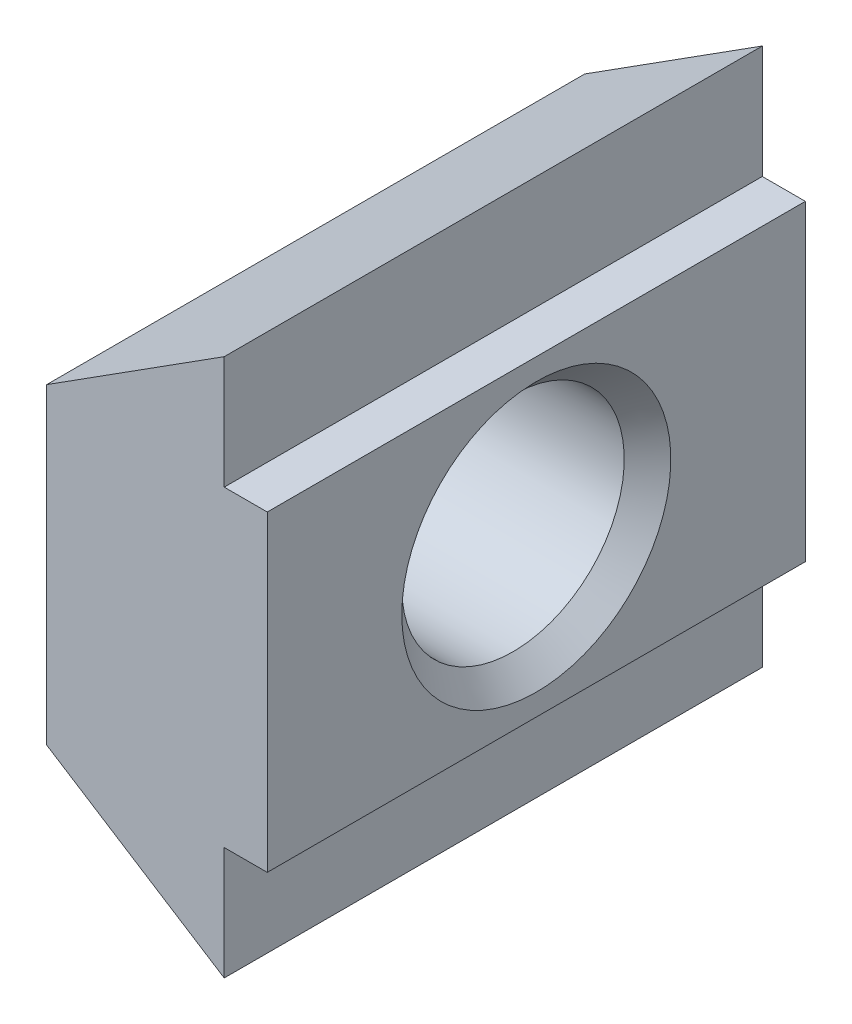
ISO-10303-21;
HEADER;
FILE_DESCRIPTION(('STEP AP214'),'2;1');
FILE_NAME('part.step','',(''),(''),'','','');
FILE_SCHEMA(('AUTOMOTIVE_DESIGN { 1 0 10303 214 1 1 1 1 }'));
ENDSEC;
DATA;
#1=APPLICATION_CONTEXT('core data for automotive mechanical design processes');
#2=APPLICATION_PROTOCOL_DEFINITION('international standard','automotive_design',2000,#1);
#3=PRODUCT_CONTEXT('',#1,'mechanical');
#4=PRODUCT('Part','Part','',(#3));
#5=PRODUCT_RELATED_PRODUCT_CATEGORY('part','',(#4));
#6=PRODUCT_DEFINITION_FORMATION('','',#4);
#7=PRODUCT_DEFINITION_CONTEXT('part definition',#1,'design');
#8=PRODUCT_DEFINITION('design','',#6,#7);
#9=PRODUCT_DEFINITION_SHAPE('','',#8);
#10=(LENGTH_UNIT() NAMED_UNIT(*) SI_UNIT(.MILLI.,.METRE.));
#11=(NAMED_UNIT(*) PLANE_ANGLE_UNIT() SI_UNIT($,.RADIAN.));
#12=(NAMED_UNIT(*) SI_UNIT($,.STERADIAN.) SOLID_ANGLE_UNIT());
#13=UNCERTAINTY_MEASURE_WITH_UNIT(LENGTH_MEASURE(1.E-05),#10,'distance_accuracy_value','');
#14=(GEOMETRIC_REPRESENTATION_CONTEXT(3) GLOBAL_UNCERTAINTY_ASSIGNED_CONTEXT((#13)) GLOBAL_UNIT_ASSIGNED_CONTEXT((#10,
#11,#12)) REPRESENTATION_CONTEXT('',''));
#15=CARTESIAN_POINT('',(0.,0.,0.));
#16=DIRECTION('',(0.,0.,1.));
#17=DIRECTION('',(1.,0.,0.));
#18=AXIS2_PLACEMENT_3D('',#15,#16,#17);
#19=CARTESIAN_POINT('',(-4.1,2.9,5.));
#20=DIRECTION('',(1.,0.,0.));
#21=DIRECTION('',(0.,0.,-1.));
#22=AXIS2_PLACEMENT_3D('',#19,#20,#21);
#23=PLANE('',#22);
#24=DIRECTION('',(0.,0.,-1.));
#25=VECTOR('',#24,1.);
#26=CARTESIAN_POINT('',(-4.1,2.9,5.));
#27=LINE('',#26,#25);
#28=CARTESIAN_POINT('',(-4.1,2.9,5.));
#29=VERTEX_POINT('',#28);
#30=CARTESIAN_POINT('',(-4.1,2.9,-5.));
#31=VERTEX_POINT('',#30);
#32=EDGE_CURVE('E11',#29,#31,#27,.T.);
#33=ORIENTED_EDGE('',*,*,#32,.T.);
#34=DIRECTION('',(0.,-1.,0.));
#35=VECTOR('',#34,1.);
#36=CARTESIAN_POINT('',(-4.1,2.9,-5.));
#37=LINE('',#36,#35);
#38=CARTESIAN_POINT('',(-4.1,-2.9,-5.));
#39=VERTEX_POINT('',#38);
#40=EDGE_CURVE('E102',#31,#39,#37,.T.);
#41=ORIENTED_EDGE('',*,*,#40,.T.);
#42=DIRECTION('',(0.,0.,-1.));
#43=VECTOR('',#42,1.);
#44=CARTESIAN_POINT('',(-4.1,-2.9,5.));
#45=LINE('',#44,#43);
#46=CARTESIAN_POINT('',(-4.1,-2.9,5.));
#47=VERTEX_POINT('',#46);
#48=EDGE_CURVE('E43',#47,#39,#45,.T.);
#49=ORIENTED_EDGE('',*,*,#48,.F.);
#50=DIRECTION('',(0.,-1.,0.));
#51=VECTOR('',#50,1.);
#52=CARTESIAN_POINT('',(-4.1,2.9,5.));
#53=LINE('',#52,#51);
#54=EDGE_CURVE('E103',#29,#47,#53,.T.);
#55=ORIENTED_EDGE('',*,*,#54,.F.);
#56=EDGE_LOOP('',(#33,#41,#49,#55));
#57=FACE_BOUND('',#56,.T.);
#58=CARTESIAN_POINT('',(-4.1,0.,0.));
#59=DIRECTION('',(-1.,0.,0.));
#60=DIRECTION('',(0.,0.,1.));
#61=AXIS2_PLACEMENT_3D('',#58,#59,#60);
#62=CIRCLE('',#61,2.5);
#63=CARTESIAN_POINT('',(-4.1,0.,2.5));
#64=VERTEX_POINT('',#63);
#65=EDGE_CURVE('E119',#64,#64,#62,.T.);
#66=ORIENTED_EDGE('',*,*,#65,.F.);
#67=EDGE_LOOP('',(#66));
#68=FACE_BOUND('',#67,.T.);
#69=ADVANCED_FACE('F35',(#57,#68),#23,.F.);
#70=CARTESIAN_POINT('',(0.,-2.9,5.));
#71=DIRECTION('',(-1.,0.,0.));
#72=DIRECTION('',(0.,0.,1.));
#73=AXIS2_PLACEMENT_3D('',#70,#71,#72);
#74=PLANE('',#73);
#75=DIRECTION('',(0.,0.,-1.));
#76=VECTOR('',#75,1.);
#77=CARTESIAN_POINT('',(0.,-2.9,5.));
#78=LINE('',#77,#76);
#79=CARTESIAN_POINT('',(0.,-2.9,5.));
#80=VERTEX_POINT('',#79);
#81=CARTESIAN_POINT('',(0.,-2.9,-5.));
#82=VERTEX_POINT('',#81);
#83=EDGE_CURVE('E159',#80,#82,#78,.T.);
#84=ORIENTED_EDGE('',*,*,#83,.T.);
#85=DIRECTION('',(0.,1.,0.));
#86=VECTOR('',#85,1.);
#87=CARTESIAN_POINT('',(0.,-2.9,-5.));
#88=LINE('',#87,#86);
#89=CARTESIAN_POINT('',(0.,2.9,-5.));
#90=VERTEX_POINT('',#89);
#91=EDGE_CURVE('E133',#82,#90,#88,.T.);
#92=ORIENTED_EDGE('',*,*,#91,.T.);
#93=DIRECTION('',(0.,0.,-1.));
#94=VECTOR('',#93,1.);
#95=CARTESIAN_POINT('',(0.,2.9,5.));
#96=LINE('',#95,#94);
#97=CARTESIAN_POINT('',(0.,2.9,5.));
#98=VERTEX_POINT('',#97);
#99=EDGE_CURVE('E157',#98,#90,#96,.T.);
#100=ORIENTED_EDGE('',*,*,#99,.F.);
#101=DIRECTION('',(0.,1.,0.));
#102=VECTOR('',#101,1.);
#103=CARTESIAN_POINT('',(0.,-2.9,5.));
#104=LINE('',#103,#102);
#105=EDGE_CURVE('E150',#80,#98,#104,.T.);
#106=ORIENTED_EDGE('',*,*,#105,.F.);
#107=EDGE_LOOP('',(#84,#92,#100,#106));
#108=FACE_BOUND('',#107,.T.);
#109=CARTESIAN_POINT('',(0.,0.,0.));
#110=DIRECTION('',(-1.,0.,0.));
#111=DIRECTION('',(0.,0.,1.));
#112=AXIS2_PLACEMENT_3D('',#109,#110,#111);
#113=CIRCLE('',#112,2.5);
#114=CARTESIAN_POINT('',(0.,0.,2.5));
#115=VERTEX_POINT('',#114);
#116=EDGE_CURVE('E291',#115,#115,#113,.T.);
#117=ORIENTED_EDGE('',*,*,#116,.T.);
#118=EDGE_LOOP('',(#117));
#119=FACE_BOUND('',#118,.T.);
#120=ADVANCED_FACE('F182',(#108,#119),#74,.F.);
#121=CARTESIAN_POINT('',(-0.8,5.,5.));
#122=DIRECTION('',(0.536875492193159,-0.843661487732108,0.));
#123=DIRECTION('',(0.843661487732108,0.536875492193159,0.));
#124=AXIS2_PLACEMENT_3D('',#121,#122,#123);
#125=PLANE('',#124);
#126=DIRECTION('',(0.,0.,-1.));
#127=VECTOR('',#126,1.);
#128=CARTESIAN_POINT('',(-0.8,5.,5.));
#129=LINE('',#128,#127);
#130=CARTESIAN_POINT('',(-0.8,5.,5.));
#131=VERTEX_POINT('',#130);
#132=CARTESIAN_POINT('',(-0.8,5.,-5.));
#133=VERTEX_POINT('',#132);
#134=EDGE_CURVE('E118',#131,#133,#129,.T.);
#135=ORIENTED_EDGE('',*,*,#134,.T.);
#136=DIRECTION('',(-0.843661487732108,-0.536875492193159,0.));
#137=VECTOR('',#136,1.);
#138=CARTESIAN_POINT('',(-0.8,5.,-5.));
#139=LINE('',#138,#137);
#140=EDGE_CURVE('E112',#133,#31,#139,.T.);
#141=ORIENTED_EDGE('',*,*,#140,.T.);
#142=ORIENTED_EDGE('',*,*,#32,.F.);
#143=DIRECTION('',(-0.843661487732108,-0.536875492193159,0.));
#144=VECTOR('',#143,1.);
#145=CARTESIAN_POINT('',(-0.8,5.,5.));
#146=LINE('',#145,#144);
#147=EDGE_CURVE('E141',#131,#29,#146,.T.);
#148=ORIENTED_EDGE('',*,*,#147,.F.);
#149=EDGE_LOOP('',(#135,#141,#142,#148));
#150=FACE_BOUND('',#149,.T.);
#151=ADVANCED_FACE('F37',(#150),#125,.F.);
#152=CARTESIAN_POINT('',(-4.1,-2.9,5.));
#153=DIRECTION('',(0.536875492193159,0.843661487732108,0.));
#154=DIRECTION('',(-0.843661487732108,0.536875492193159,0.));
#155=AXIS2_PLACEMENT_3D('',#152,#153,#154);
#156=PLANE('',#155);
#157=ORIENTED_EDGE('',*,*,#48,.T.);
#158=DIRECTION('',(0.843661487732108,-0.536875492193159,0.));
#159=VECTOR('',#158,1.);
#160=CARTESIAN_POINT('',(-4.1,-2.9,-5.));
#161=LINE('',#160,#159);
#162=CARTESIAN_POINT('',(-0.8,-5.,-5.));
#163=VERTEX_POINT('',#162);
#164=EDGE_CURVE('E116',#39,#163,#161,.T.);
#165=ORIENTED_EDGE('',*,*,#164,.T.);
#166=DIRECTION('',(0.,0.,-1.));
#167=VECTOR('',#166,1.);
#168=CARTESIAN_POINT('',(-0.8,-5.,5.));
#169=LINE('',#168,#167);
#170=CARTESIAN_POINT('',(-0.8,-5.,5.));
#171=VERTEX_POINT('',#170);
#172=EDGE_CURVE('E163',#171,#163,#169,.T.);
#173=ORIENTED_EDGE('',*,*,#172,.F.);
#174=DIRECTION('',(0.843661487732108,-0.536875492193159,0.));
#175=VECTOR('',#174,1.);
#176=CARTESIAN_POINT('',(-4.1,-2.9,5.));
#177=LINE('',#176,#175);
#178=EDGE_CURVE('E144',#47,#171,#177,.T.);
#179=ORIENTED_EDGE('',*,*,#178,.F.);
#180=EDGE_LOOP('',(#157,#165,#173,#179));
#181=FACE_BOUND('',#180,.T.);
#182=ADVANCED_FACE('F166',(#181),#156,.F.);
#183=CARTESIAN_POINT('',(-0.8,-5.,5.));
#184=DIRECTION('',(-1.,0.,0.));
#185=DIRECTION('',(0.,0.,1.));
#186=AXIS2_PLACEMENT_3D('',#183,#184,#185);
#187=PLANE('',#186);
#188=ORIENTED_EDGE('',*,*,#172,.T.);
#189=DIRECTION('',(0.,1.,0.));
#190=VECTOR('',#189,1.);
#191=CARTESIAN_POINT('',(-0.8,-5.,-5.));
#192=LINE('',#191,#190);
#193=CARTESIAN_POINT('',(-0.8,-2.9,-5.));
#194=VERTEX_POINT('',#193);
#195=EDGE_CURVE('E127',#163,#194,#192,.T.);
#196=ORIENTED_EDGE('',*,*,#195,.T.);
#197=DIRECTION('',(0.,0.,-1.));
#198=VECTOR('',#197,1.);
#199=CARTESIAN_POINT('',(-0.8,-2.9,5.));
#200=LINE('',#199,#198);
#201=CARTESIAN_POINT('',(-0.8,-2.9,5.));
#202=VERTEX_POINT('',#201);
#203=EDGE_CURVE('E161',#202,#194,#200,.T.);
#204=ORIENTED_EDGE('',*,*,#203,.F.);
#205=DIRECTION('',(0.,1.,0.));
#206=VECTOR('',#205,1.);
#207=CARTESIAN_POINT('',(-0.8,-5.,5.));
#208=LINE('',#207,#206);
#209=EDGE_CURVE('E146',#171,#202,#208,.T.);
#210=ORIENTED_EDGE('',*,*,#209,.F.);
#211=EDGE_LOOP('',(#188,#196,#204,#210));
#212=FACE_BOUND('',#211,.T.);
#213=ADVANCED_FACE('F174',(#212),#187,.F.);
#214=CARTESIAN_POINT('',(-0.8,-2.9,5.));
#215=DIRECTION('',(0.,1.,0.));
#216=DIRECTION('',(0.,0.,1.));
#217=AXIS2_PLACEMENT_3D('',#214,#215,#216);
#218=PLANE('',#217);
#219=ORIENTED_EDGE('',*,*,#203,.T.);
#220=DIRECTION('',(1.,0.,0.));
#221=VECTOR('',#220,1.);
#222=CARTESIAN_POINT('',(-0.8,-2.9,-5.));
#223=LINE('',#222,#221);
#224=EDGE_CURVE('E130',#194,#82,#223,.T.);
#225=ORIENTED_EDGE('',*,*,#224,.T.);
#226=ORIENTED_EDGE('',*,*,#83,.F.);
#227=DIRECTION('',(1.,0.,0.));
#228=VECTOR('',#227,1.);
#229=CARTESIAN_POINT('',(-0.8,-2.9,5.));
#230=LINE('',#229,#228);
#231=EDGE_CURVE('E148',#202,#80,#230,.T.);
#232=ORIENTED_EDGE('',*,*,#231,.F.);
#233=EDGE_LOOP('',(#219,#225,#226,#232));
#234=FACE_BOUND('',#233,.T.);
#235=ADVANCED_FACE('F177',(#234),#218,.F.);
#236=CARTESIAN_POINT('',(0.,2.9,5.));
#237=DIRECTION('',(0.,-1.,0.));
#238=DIRECTION('',(0.,0.,-1.));
#239=AXIS2_PLACEMENT_3D('',#236,#237,#238);
#240=PLANE('',#239);
#241=ORIENTED_EDGE('',*,*,#99,.T.);
#242=DIRECTION('',(-1.,0.,0.));
#243=VECTOR('',#242,1.);
#244=CARTESIAN_POINT('',(0.,2.9,-5.));
#245=LINE('',#244,#243);
#246=CARTESIAN_POINT('',(-0.8,2.9,-5.));
#247=VERTEX_POINT('',#246);
#248=EDGE_CURVE('E136',#90,#247,#245,.T.);
#249=ORIENTED_EDGE('',*,*,#248,.T.);
#250=DIRECTION('',(0.,0.,-1.));
#251=VECTOR('',#250,1.);
#252=CARTESIAN_POINT('',(-0.8,2.9,5.));
#253=LINE('',#252,#251);
#254=CARTESIAN_POINT('',(-0.8,2.9,5.));
#255=VERTEX_POINT('',#254);
#256=EDGE_CURVE('E155',#255,#247,#253,.T.);
#257=ORIENTED_EDGE('',*,*,#256,.F.);
#258=DIRECTION('',(-1.,0.,0.));
#259=VECTOR('',#258,1.);
#260=CARTESIAN_POINT('',(0.,2.9,5.));
#261=LINE('',#260,#259);
#262=EDGE_CURVE('E55',#98,#255,#261,.T.);
#263=ORIENTED_EDGE('',*,*,#262,.F.);
#264=EDGE_LOOP('',(#241,#249,#257,#263));
#265=FACE_BOUND('',#264,.T.);
#266=ADVANCED_FACE('F186',(#265),#240,.F.);
#267=CARTESIAN_POINT('',(-0.8,2.9,5.));
#268=DIRECTION('',(-1.,0.,0.));
#269=DIRECTION('',(0.,0.,1.));
#270=AXIS2_PLACEMENT_3D('',#267,#268,#269);
#271=PLANE('',#270);
#272=ORIENTED_EDGE('',*,*,#256,.T.);
#273=DIRECTION('',(0.,1.,0.));
#274=VECTOR('',#273,1.);
#275=CARTESIAN_POINT('',(-0.8,2.9,-5.));
#276=LINE('',#275,#274);
#277=EDGE_CURVE('E139',#247,#133,#276,.T.);
#278=ORIENTED_EDGE('',*,*,#277,.T.);
#279=ORIENTED_EDGE('',*,*,#134,.F.);
#280=DIRECTION('',(0.,1.,0.));
#281=VECTOR('',#280,1.);
#282=CARTESIAN_POINT('',(-0.8,2.9,5.));
#283=LINE('',#282,#281);
#284=EDGE_CURVE('E50',#255,#131,#283,.T.);
#285=ORIENTED_EDGE('',*,*,#284,.F.);
#286=EDGE_LOOP('',(#272,#278,#279,#285));
#287=FACE_BOUND('',#286,.T.);
#288=ADVANCED_FACE('F188',(#287),#271,.F.);
#289=CARTESIAN_POINT('',(0.,0.,5.));
#290=DIRECTION('',(0.,0.,1.));
#291=DIRECTION('',(1.,0.,0.));
#292=AXIS2_PLACEMENT_3D('',#289,#290,#291);
#293=PLANE('',#292);
#294=ORIENTED_EDGE('',*,*,#147,.T.);
#295=ORIENTED_EDGE('',*,*,#54,.T.);
#296=ORIENTED_EDGE('',*,*,#178,.T.);
#297=ORIENTED_EDGE('',*,*,#209,.T.);
#298=ORIENTED_EDGE('',*,*,#231,.T.);
#299=ORIENTED_EDGE('',*,*,#105,.T.);
#300=ORIENTED_EDGE('',*,*,#262,.T.);
#301=ORIENTED_EDGE('',*,*,#284,.T.);
#302=EDGE_LOOP('',(#294,#295,#296,#297,#298,#299,#300,#301));
#303=FACE_BOUND('',#302,.T.);
#304=ADVANCED_FACE('F169',(#303),#293,.T.);
#305=CARTESIAN_POINT('',(0.,0.,-5.));
#306=DIRECTION('',(0.,0.,1.));
#307=DIRECTION('',(1.,0.,0.));
#308=AXIS2_PLACEMENT_3D('',#305,#306,#307);
#309=PLANE('',#308);
#310=ORIENTED_EDGE('',*,*,#140,.F.);
#311=ORIENTED_EDGE('',*,*,#277,.F.);
#312=ORIENTED_EDGE('',*,*,#248,.F.);
#313=ORIENTED_EDGE('',*,*,#91,.F.);
#314=ORIENTED_EDGE('',*,*,#224,.F.);
#315=ORIENTED_EDGE('',*,*,#195,.F.);
#316=ORIENTED_EDGE('',*,*,#164,.F.);
#317=ORIENTED_EDGE('',*,*,#40,.F.);
#318=EDGE_LOOP('',(#310,#311,#312,#313,#314,#315,#316,#317));
#319=FACE_BOUND('',#318,.T.);
#320=ADVANCED_FACE('F110',(#319),#309,.F.);
#321=CARTESIAN_POINT('',(-3.667,0.,0.));
#322=DIRECTION('',(-1.,0.,0.));
#323=DIRECTION('',(0.,0.,1.));
#324=AXIS2_PLACEMENT_3D('',#321,#322,#323);
#325=CONICAL_SURFACE('',#324,2.067,0.785398163397448);
#326=ORIENTED_EDGE('',*,*,#65,.T.);
#327=EDGE_LOOP('',(#326));
#328=FACE_BOUND('',#327,.T.);
#329=CARTESIAN_POINT('',(-3.667,0.,0.));
#330=DIRECTION('',(-1.,0.,0.));
#331=DIRECTION('',(0.,0.,1.));
#332=AXIS2_PLACEMENT_3D('',#329,#330,#331);
#333=CIRCLE('',#332,2.067);
#334=CARTESIAN_POINT('',(-3.667,0.,2.067));
#335=VERTEX_POINT('',#334);
#336=EDGE_CURVE('E122',#335,#335,#333,.T.);
#337=ORIENTED_EDGE('',*,*,#336,.F.);
#338=EDGE_LOOP('',(#337));
#339=FACE_BOUND('',#338,.T.);
#340=ADVANCED_FACE('F236',(#328,#339),#325,.F.);
#341=CARTESIAN_POINT('',(0.,0.,0.));
#342=DIRECTION('',(-1.,0.,0.));
#343=DIRECTION('',(0.,0.,1.));
#344=AXIS2_PLACEMENT_3D('',#341,#342,#343);
#345=CYLINDRICAL_SURFACE('',#344,2.067);
#346=ORIENTED_EDGE('',*,*,#336,.T.);
#347=EDGE_LOOP('',(#346));
#348=FACE_BOUND('',#347,.T.);
#349=CARTESIAN_POINT('',(-0.433,0.,0.));
#350=DIRECTION('',(-1.,0.,0.));
#351=DIRECTION('',(0.,0.,1.));
#352=AXIS2_PLACEMENT_3D('',#349,#350,#351);
#353=CIRCLE('',#352,2.067);
#354=CARTESIAN_POINT('',(-0.433,0.,2.067));
#355=VERTEX_POINT('',#354);
#356=EDGE_CURVE('E288',#355,#355,#353,.T.);
#357=ORIENTED_EDGE('',*,*,#356,.F.);
#358=EDGE_LOOP('',(#357));
#359=FACE_BOUND('',#358,.T.);
#360=ADVANCED_FACE('F259',(#348,#359),#345,.F.);
#361=CARTESIAN_POINT('',(0.,0.,0.));
#362=DIRECTION('',(1.,0.,0.));
#363=DIRECTION('',(0.,0.,-1.));
#364=AXIS2_PLACEMENT_3D('',#361,#362,#363);
#365=CONICAL_SURFACE('',#364,2.5,0.785398163397449);
#366=ORIENTED_EDGE('',*,*,#356,.T.);
#367=EDGE_LOOP('',(#366));
#368=FACE_BOUND('',#367,.T.);
#369=ORIENTED_EDGE('',*,*,#116,.F.);
#370=EDGE_LOOP('',(#369));
#371=FACE_BOUND('',#370,.T.);
#372=ADVANCED_FACE('F270',(#368,#371),#365,.F.);
#373=CLOSED_SHELL('',(#69,#120,#151,#182,#213,#235,#266,#288,#304,#320,#340,#360,#372));
#374=MANIFOLD_SOLID_BREP('B2',#373);
#375=ADVANCED_BREP_SHAPE_REPRESENTATION('',(#18,#374),#14);
#376=SHAPE_DEFINITION_REPRESENTATION(#9,#375);
ENDSEC;
END-ISO-10303-21;
